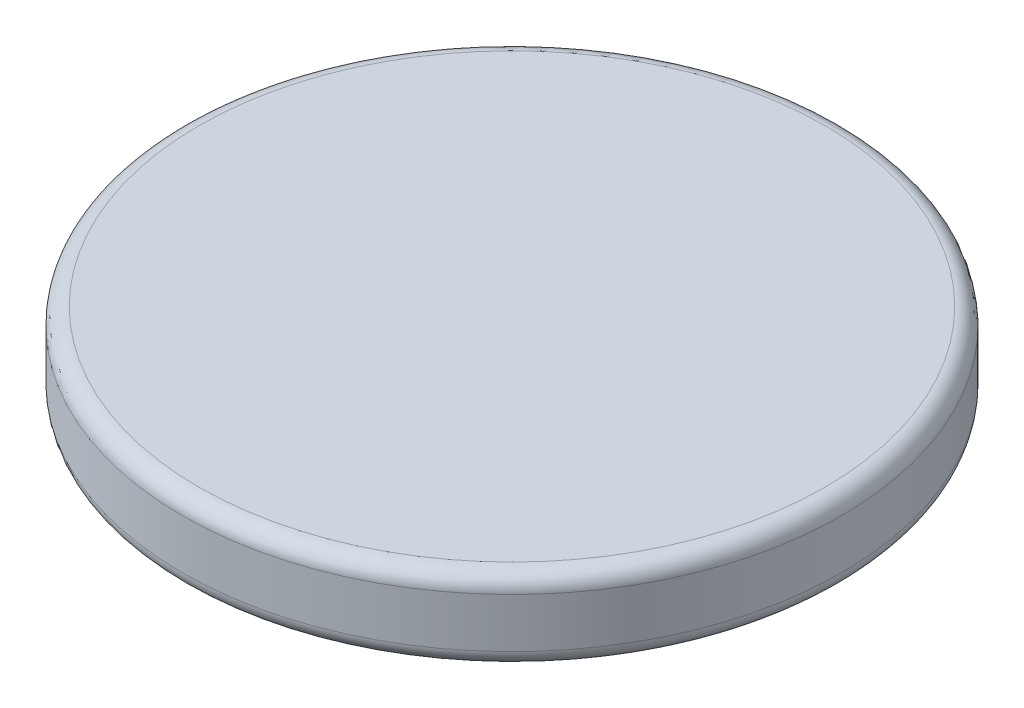
ISO-10303-21;
HEADER;
FILE_DESCRIPTION(('STEP AP214'),'2;1');
FILE_NAME('part.step','',(''),(''),'','','');
FILE_SCHEMA(('AUTOMOTIVE_DESIGN { 1 0 10303 214 1 1 1 1 }'));
ENDSEC;
DATA;
#1=APPLICATION_CONTEXT('core data for automotive mechanical design processes');
#2=APPLICATION_PROTOCOL_DEFINITION('international standard','automotive_design',2000,#1);
#3=PRODUCT_CONTEXT('',#1,'mechanical');
#4=PRODUCT('Part','Part','',(#3));
#5=PRODUCT_RELATED_PRODUCT_CATEGORY('part','',(#4));
#6=PRODUCT_DEFINITION_FORMATION('','',#4);
#7=PRODUCT_DEFINITION_CONTEXT('part definition',#1,'design');
#8=PRODUCT_DEFINITION('design','',#6,#7);
#9=PRODUCT_DEFINITION_SHAPE('','',#8);
#10=(LENGTH_UNIT() NAMED_UNIT(*) SI_UNIT(.MILLI.,.METRE.));
#11=(NAMED_UNIT(*) PLANE_ANGLE_UNIT() SI_UNIT($,.RADIAN.));
#12=(NAMED_UNIT(*) SI_UNIT($,.STERADIAN.) SOLID_ANGLE_UNIT());
#13=UNCERTAINTY_MEASURE_WITH_UNIT(LENGTH_MEASURE(1.E-05),#10,'distance_accuracy_value','');
#14=(GEOMETRIC_REPRESENTATION_CONTEXT(3) GLOBAL_UNCERTAINTY_ASSIGNED_CONTEXT((#13)) GLOBAL_UNIT_ASSIGNED_CONTEXT((#10,
#11,#12)) REPRESENTATION_CONTEXT('',''));
#15=CARTESIAN_POINT('',(0.,0.,0.));
#16=DIRECTION('',(0.,0.,1.));
#17=DIRECTION('',(1.,0.,0.));
#18=AXIS2_PLACEMENT_3D('',#15,#16,#17);
#19=CARTESIAN_POINT('',(0.,10.,0.));
#20=DIRECTION('',(0.,-1.,0.));
#21=DIRECTION('',(0.,0.,-1.));
#22=AXIS2_PLACEMENT_3D('',#19,#20,#21);
#23=CYLINDRICAL_SURFACE('',#22,40.);
#24=CARTESIAN_POINT('',(0.,2.,0.));
#25=DIRECTION('',(0.,1.,0.));
#26=DIRECTION('',(0.,0.,1.));
#27=AXIS2_PLACEMENT_3D('',#24,#25,#26);
#28=CIRCLE('',#27,40.);
#29=CARTESIAN_POINT('',(0.,2.,40.));
#30=VERTEX_POINT('',#29);
#31=EDGE_CURVE('E45',#30,#30,#28,.T.);
#32=ORIENTED_EDGE('',*,*,#31,.T.);
#33=EDGE_LOOP('',(#32));
#34=FACE_BOUND('',#33,.T.);
#35=CARTESIAN_POINT('',(0.,8.,0.));
#36=DIRECTION('',(0.,1.,0.));
#37=DIRECTION('',(0.,0.,1.));
#38=AXIS2_PLACEMENT_3D('',#35,#36,#37);
#39=CIRCLE('',#38,40.);
#40=CARTESIAN_POINT('',(0.,8.,40.));
#41=VERTEX_POINT('',#40);
#42=EDGE_CURVE('E49',#41,#41,#39,.F.);
#43=ORIENTED_EDGE('',*,*,#42,.T.);
#44=EDGE_LOOP('',(#43));
#45=FACE_BOUND('',#44,.T.);
#46=ADVANCED_FACE('F34',(#34,#45),#23,.T.);
#47=CARTESIAN_POINT('',(0.,10.,0.));
#48=DIRECTION('',(0.,1.,0.));
#49=DIRECTION('',(0.,0.,1.));
#50=AXIS2_PLACEMENT_3D('',#47,#48,#49);
#51=PLANE('',#50);
#52=CARTESIAN_POINT('',(0.,10.,0.));
#53=DIRECTION('',(0.,1.,0.));
#54=DIRECTION('',(0.,0.,1.));
#55=AXIS2_PLACEMENT_3D('',#52,#53,#54);
#56=CIRCLE('',#55,38.);
#57=CARTESIAN_POINT('',(0.,10.,38.));
#58=VERTEX_POINT('',#57);
#59=EDGE_CURVE('E10',#58,#58,#56,.T.);
#60=ORIENTED_EDGE('',*,*,#59,.T.);
#61=EDGE_LOOP('',(#60));
#62=FACE_BOUND('',#61,.T.);
#63=ADVANCED_FACE('F65',(#62),#51,.T.);
#64=CARTESIAN_POINT('',(0.,0.,0.));
#65=DIRECTION('',(0.,1.,0.));
#66=DIRECTION('',(0.,0.,1.));
#67=AXIS2_PLACEMENT_3D('',#64,#65,#66);
#68=PLANE('',#67);
#69=CARTESIAN_POINT('',(0.,0.,0.));
#70=DIRECTION('',(0.,1.,0.));
#71=DIRECTION('',(0.,0.,1.));
#72=AXIS2_PLACEMENT_3D('',#69,#70,#71);
#73=CIRCLE('',#72,38.);
#74=CARTESIAN_POINT('',(0.,0.,38.));
#75=VERTEX_POINT('',#74);
#76=EDGE_CURVE('E41',#75,#75,#73,.F.);
#77=ORIENTED_EDGE('',*,*,#76,.T.);
#78=EDGE_LOOP('',(#77));
#79=FACE_BOUND('',#78,.T.);
#80=ADVANCED_FACE('F62',(#79),#68,.F.);
#81=CARTESIAN_POINT('',(0.,2.,0.));
#82=DIRECTION('',(0.,1.,0.));
#83=DIRECTION('',(0.,0.,1.));
#84=AXIS2_PLACEMENT_3D('',#81,#82,#83);
#85=TOROIDAL_SURFACE('',#84,38.,2.);
#86=ORIENTED_EDGE('',*,*,#76,.F.);
#87=EDGE_LOOP('',(#86));
#88=FACE_BOUND('',#87,.T.);
#89=ORIENTED_EDGE('',*,*,#31,.F.);
#90=EDGE_LOOP('',(#89));
#91=FACE_BOUND('',#90,.T.);
#92=ADVANCED_FACE('F58',(#88,#91),#85,.T.);
#93=CARTESIAN_POINT('',(0.,8.,0.));
#94=DIRECTION('',(0.,1.,0.));
#95=DIRECTION('',(0.,0.,1.));
#96=AXIS2_PLACEMENT_3D('',#93,#94,#95);
#97=TOROIDAL_SURFACE('',#96,38.,2.);
#98=ORIENTED_EDGE('',*,*,#42,.F.);
#99=EDGE_LOOP('',(#98));
#100=FACE_BOUND('',#99,.T.);
#101=ORIENTED_EDGE('',*,*,#59,.F.);
#102=EDGE_LOOP('',(#101));
#103=FACE_BOUND('',#102,.T.);
#104=ADVANCED_FACE('F36',(#100,#103),#97,.T.);
#105=CLOSED_SHELL('',(#46,#63,#80,#92,#104));
#106=MANIFOLD_SOLID_BREP('B2',#105);
#107=ADVANCED_BREP_SHAPE_REPRESENTATION('',(#18,#106),#14);
#108=SHAPE_DEFINITION_REPRESENTATION(#9,#107);
ENDSEC;
END-ISO-10303-21;
